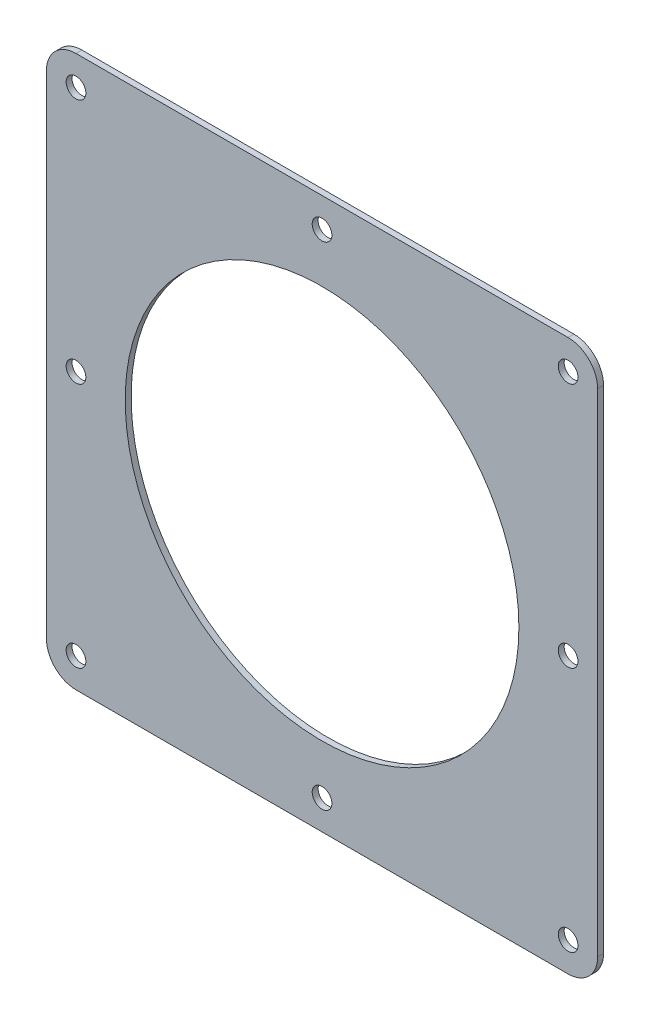
ISO-10303-21;
HEADER;
FILE_DESCRIPTION(('STEP AP214'),'2;1');
FILE_NAME('part.step','',(''),(''),'','','');
FILE_SCHEMA(('AUTOMOTIVE_DESIGN { 1 0 10303 214 1 1 1 1 }'));
ENDSEC;
DATA;
#1=APPLICATION_CONTEXT('core data for automotive mechanical design processes');
#2=APPLICATION_PROTOCOL_DEFINITION('international standard','automotive_design',2000,#1);
#3=PRODUCT_CONTEXT('',#1,'mechanical');
#4=PRODUCT('Part','Part','',(#3));
#5=PRODUCT_RELATED_PRODUCT_CATEGORY('part','',(#4));
#6=PRODUCT_DEFINITION_FORMATION('','',#4);
#7=PRODUCT_DEFINITION_CONTEXT('part definition',#1,'design');
#8=PRODUCT_DEFINITION('design','',#6,#7);
#9=PRODUCT_DEFINITION_SHAPE('','',#8);
#10=(LENGTH_UNIT() NAMED_UNIT(*) SI_UNIT(.MILLI.,.METRE.));
#11=(NAMED_UNIT(*) PLANE_ANGLE_UNIT() SI_UNIT($,.RADIAN.));
#12=(NAMED_UNIT(*) SI_UNIT($,.STERADIAN.) SOLID_ANGLE_UNIT());
#13=UNCERTAINTY_MEASURE_WITH_UNIT(LENGTH_MEASURE(1.E-05),#10,'distance_accuracy_value','');
#14=(GEOMETRIC_REPRESENTATION_CONTEXT(3) GLOBAL_UNCERTAINTY_ASSIGNED_CONTEXT((#13)) GLOBAL_UNIT_ASSIGNED_CONTEXT((#10,
#11,#12)) REPRESENTATION_CONTEXT('',''));
#15=CARTESIAN_POINT('',(0.,0.,0.));
#16=DIRECTION('',(0.,0.,1.));
#17=DIRECTION('',(1.,0.,0.));
#18=AXIS2_PLACEMENT_3D('',#15,#16,#17);
#19=CARTESIAN_POINT('',(-125.,-125.,3.));
#20=DIRECTION('',(0.,0.,1.));
#21=DIRECTION('',(1.,0.,0.));
#22=AXIS2_PLACEMENT_3D('',#19,#20,#21);
#23=PLANE('',#22);
#24=CARTESIAN_POINT('',(0.,0.,3.));
#25=DIRECTION('',(0.,0.,1.));
#26=DIRECTION('',(1.,0.,0.));
#27=AXIS2_PLACEMENT_3D('',#24,#25,#26);
#28=CIRCLE('',#27,100.);
#29=CARTESIAN_POINT('',(100.,0.,3.));
#30=VERTEX_POINT('',#29);
#31=EDGE_CURVE('E227',#30,#30,#28,.T.);
#32=ORIENTED_EDGE('',*,*,#31,.F.);
#33=EDGE_LOOP('',(#32));
#34=FACE_BOUND('',#33,.T.);
#35=CARTESIAN_POINT('',(0.,-125.,3.));
#36=DIRECTION('',(0.,0.,1.));
#37=DIRECTION('',(1.,0.,0.));
#38=AXIS2_PLACEMENT_3D('',#35,#36,#37);
#39=CIRCLE('',#38,5.);
#40=CARTESIAN_POINT('',(5.,-125.,3.));
#41=VERTEX_POINT('',#40);
#42=EDGE_CURVE('E213',#41,#41,#39,.T.);
#43=ORIENTED_EDGE('',*,*,#42,.F.);
#44=EDGE_LOOP('',(#43));
#45=FACE_BOUND('',#44,.T.);
#46=CARTESIAN_POINT('',(125.,0.,3.));
#47=DIRECTION('',(0.,0.,1.));
#48=DIRECTION('',(1.,0.,0.));
#49=AXIS2_PLACEMENT_3D('',#46,#47,#48);
#50=CIRCLE('',#49,5.00000000000001);
#51=CARTESIAN_POINT('',(130.,0.,3.));
#52=VERTEX_POINT('',#51);
#53=EDGE_CURVE('E195',#52,#52,#50,.T.);
#54=ORIENTED_EDGE('',*,*,#53,.F.);
#55=EDGE_LOOP('',(#54));
#56=FACE_BOUND('',#55,.T.);
#57=CARTESIAN_POINT('',(0.,125.,3.));
#58=DIRECTION('',(0.,0.,1.));
#59=DIRECTION('',(1.,0.,0.));
#60=AXIS2_PLACEMENT_3D('',#57,#58,#59);
#61=CIRCLE('',#60,5.);
#62=CARTESIAN_POINT('',(4.99999999999999,125.,3.));
#63=VERTEX_POINT('',#62);
#64=EDGE_CURVE('E183',#63,#63,#61,.T.);
#65=ORIENTED_EDGE('',*,*,#64,.F.);
#66=EDGE_LOOP('',(#65));
#67=FACE_BOUND('',#66,.T.);
#68=CARTESIAN_POINT('',(-125.,-125.,3.));
#69=DIRECTION('',(0.,0.,1.));
#70=DIRECTION('',(1.,0.,0.));
#71=AXIS2_PLACEMENT_3D('',#68,#69,#70);
#72=CIRCLE('',#71,15.);
#73=CARTESIAN_POINT('',(-140.,-125.,3.));
#74=VERTEX_POINT('',#73);
#75=CARTESIAN_POINT('',(-125.,-140.,3.));
#76=VERTEX_POINT('',#75);
#77=EDGE_CURVE('E145',#74,#76,#72,.T.);
#78=ORIENTED_EDGE('',*,*,#77,.T.);
#79=DIRECTION('',(1.,0.,0.));
#80=VECTOR('',#79,1.);
#81=CARTESIAN_POINT('',(-125.,-140.,3.));
#82=LINE('',#81,#80);
#83=CARTESIAN_POINT('',(125.,-140.,3.));
#84=VERTEX_POINT('',#83);
#85=EDGE_CURVE('E93',#76,#84,#82,.T.);
#86=ORIENTED_EDGE('',*,*,#85,.T.);
#87=CARTESIAN_POINT('',(125.,-125.,3.));
#88=DIRECTION('',(0.,0.,1.));
#89=DIRECTION('',(1.,0.,0.));
#90=AXIS2_PLACEMENT_3D('',#87,#88,#89);
#91=CIRCLE('',#90,15.);
#92=CARTESIAN_POINT('',(140.,-125.,3.));
#93=VERTEX_POINT('',#92);
#94=EDGE_CURVE('E161',#84,#93,#91,.T.);
#95=ORIENTED_EDGE('',*,*,#94,.T.);
#96=DIRECTION('',(0.,1.,0.));
#97=VECTOR('',#96,1.);
#98=CARTESIAN_POINT('',(140.,125.,3.));
#99=LINE('',#98,#97);
#100=CARTESIAN_POINT('',(140.,125.,3.));
#101=VERTEX_POINT('',#100);
#102=EDGE_CURVE('E174',#93,#101,#99,.T.);
#103=ORIENTED_EDGE('',*,*,#102,.T.);
#104=CARTESIAN_POINT('',(125.,125.,3.));
#105=DIRECTION('',(0.,0.,1.));
#106=DIRECTION('',(-1.,0.,0.));
#107=AXIS2_PLACEMENT_3D('',#104,#105,#106);
#108=CIRCLE('',#107,15.);
#109=CARTESIAN_POINT('',(125.,140.,3.));
#110=VERTEX_POINT('',#109);
#111=EDGE_CURVE('E112',#101,#110,#108,.T.);
#112=ORIENTED_EDGE('',*,*,#111,.T.);
#113=DIRECTION('',(-1.,0.,0.));
#114=VECTOR('',#113,1.);
#115=CARTESIAN_POINT('',(-125.,140.,3.));
#116=LINE('',#115,#114);
#117=CARTESIAN_POINT('',(-125.,140.,3.));
#118=VERTEX_POINT('',#117);
#119=EDGE_CURVE('E106',#110,#118,#116,.T.);
#120=ORIENTED_EDGE('',*,*,#119,.T.);
#121=CARTESIAN_POINT('',(-125.,125.,3.));
#122=DIRECTION('',(0.,0.,1.));
#123=DIRECTION('',(1.,0.,0.));
#124=AXIS2_PLACEMENT_3D('',#121,#122,#123);
#125=CIRCLE('',#124,15.);
#126=CARTESIAN_POINT('',(-140.,125.,3.));
#127=VERTEX_POINT('',#126);
#128=EDGE_CURVE('E110',#118,#127,#125,.T.);
#129=ORIENTED_EDGE('',*,*,#128,.T.);
#130=DIRECTION('',(0.,-1.,0.));
#131=VECTOR('',#130,1.);
#132=CARTESIAN_POINT('',(-140.,125.,3.));
#133=LINE('',#132,#131);
#134=EDGE_CURVE('E50',#127,#74,#133,.T.);
#135=ORIENTED_EDGE('',*,*,#134,.T.);
#136=EDGE_LOOP('',(#78,#86,#95,#103,#112,#120,#129,#135));
#137=FACE_BOUND('',#136,.T.);
#138=CARTESIAN_POINT('',(-125.,125.,3.));
#139=DIRECTION('',(0.,0.,1.));
#140=DIRECTION('',(1.,0.,0.));
#141=AXIS2_PLACEMENT_3D('',#138,#139,#140);
#142=CIRCLE('',#141,5.00000000000001);
#143=CARTESIAN_POINT('',(-120.,125.,3.));
#144=VERTEX_POINT('',#143);
#145=EDGE_CURVE('E134',#144,#144,#142,.T.);
#146=ORIENTED_EDGE('',*,*,#145,.F.);
#147=EDGE_LOOP('',(#146));
#148=FACE_BOUND('',#147,.T.);
#149=CARTESIAN_POINT('',(125.,125.,3.));
#150=DIRECTION('',(0.,0.,1.));
#151=DIRECTION('',(1.,0.,0.));
#152=AXIS2_PLACEMENT_3D('',#149,#150,#151);
#153=CIRCLE('',#152,4.99999999999999);
#154=CARTESIAN_POINT('',(130.,125.,3.));
#155=VERTEX_POINT('',#154);
#156=EDGE_CURVE('E189',#155,#155,#153,.T.);
#157=ORIENTED_EDGE('',*,*,#156,.F.);
#158=EDGE_LOOP('',(#157));
#159=FACE_BOUND('',#158,.T.);
#160=CARTESIAN_POINT('',(-125.,0.,3.));
#161=DIRECTION('',(0.,0.,1.));
#162=DIRECTION('',(1.,0.,0.));
#163=AXIS2_PLACEMENT_3D('',#160,#161,#162);
#164=CIRCLE('',#163,5.);
#165=CARTESIAN_POINT('',(-120.,0.,3.));
#166=VERTEX_POINT('',#165);
#167=EDGE_CURVE('E201',#166,#166,#164,.T.);
#168=ORIENTED_EDGE('',*,*,#167,.F.);
#169=EDGE_LOOP('',(#168));
#170=FACE_BOUND('',#169,.T.);
#171=CARTESIAN_POINT('',(-125.,-125.,3.));
#172=DIRECTION('',(0.,0.,1.));
#173=DIRECTION('',(1.,0.,0.));
#174=AXIS2_PLACEMENT_3D('',#171,#172,#173);
#175=CIRCLE('',#174,5.00000000000001);
#176=CARTESIAN_POINT('',(-120.,-125.,3.));
#177=VERTEX_POINT('',#176);
#178=EDGE_CURVE('E207',#177,#177,#175,.T.);
#179=ORIENTED_EDGE('',*,*,#178,.F.);
#180=EDGE_LOOP('',(#179));
#181=FACE_BOUND('',#180,.T.);
#182=CARTESIAN_POINT('',(125.,-125.,3.));
#183=DIRECTION('',(0.,0.,1.));
#184=DIRECTION('',(1.,0.,0.));
#185=AXIS2_PLACEMENT_3D('',#182,#183,#184);
#186=CIRCLE('',#185,5.00000000000002);
#187=CARTESIAN_POINT('',(130.,-125.,3.));
#188=VERTEX_POINT('',#187);
#189=EDGE_CURVE('E219',#188,#188,#186,.T.);
#190=ORIENTED_EDGE('',*,*,#189,.F.);
#191=EDGE_LOOP('',(#190));
#192=FACE_BOUND('',#191,.T.);
#193=ADVANCED_FACE('F32',(#34,#45,#56,#67,#137,#148,#159,#170,#181,#192),#23,.T.);
#194=CARTESIAN_POINT('',(-125.,-125.,0.));
#195=DIRECTION('',(0.,0.,1.));
#196=DIRECTION('',(1.,0.,0.));
#197=AXIS2_PLACEMENT_3D('',#194,#195,#196);
#198=PLANE('',#197);
#199=CARTESIAN_POINT('',(0.,0.,0.));
#200=DIRECTION('',(0.,0.,1.));
#201=DIRECTION('',(1.,0.,0.));
#202=AXIS2_PLACEMENT_3D('',#199,#200,#201);
#203=CIRCLE('',#202,100.);
#204=CARTESIAN_POINT('',(100.,0.,0.));
#205=VERTEX_POINT('',#204);
#206=EDGE_CURVE('E36',#205,#205,#203,.T.);
#207=ORIENTED_EDGE('',*,*,#206,.T.);
#208=EDGE_LOOP('',(#207));
#209=FACE_BOUND('',#208,.T.);
#210=CARTESIAN_POINT('',(-125.,-125.,0.));
#211=DIRECTION('',(0.,0.,1.));
#212=DIRECTION('',(1.,0.,0.));
#213=AXIS2_PLACEMENT_3D('',#210,#211,#212);
#214=CIRCLE('',#213,15.);
#215=CARTESIAN_POINT('',(-140.,-125.,0.));
#216=VERTEX_POINT('',#215);
#217=CARTESIAN_POINT('',(-125.,-140.,0.));
#218=VERTEX_POINT('',#217);
#219=EDGE_CURVE('E130',#216,#218,#214,.T.);
#220=ORIENTED_EDGE('',*,*,#219,.F.);
#221=DIRECTION('',(0.,-1.,0.));
#222=VECTOR('',#221,1.);
#223=CARTESIAN_POINT('',(-140.,125.,0.));
#224=LINE('',#223,#222);
#225=CARTESIAN_POINT('',(-140.,125.,0.));
#226=VERTEX_POINT('',#225);
#227=EDGE_CURVE('E85',#226,#216,#224,.T.);
#228=ORIENTED_EDGE('',*,*,#227,.F.);
#229=CARTESIAN_POINT('',(-125.,125.,0.));
#230=DIRECTION('',(0.,0.,1.));
#231=DIRECTION('',(1.,0.,0.));
#232=AXIS2_PLACEMENT_3D('',#229,#230,#231);
#233=CIRCLE('',#232,15.);
#234=CARTESIAN_POINT('',(-125.,140.,0.));
#235=VERTEX_POINT('',#234);
#236=EDGE_CURVE('E79',#235,#226,#233,.T.);
#237=ORIENTED_EDGE('',*,*,#236,.F.);
#238=DIRECTION('',(-1.,0.,0.));
#239=VECTOR('',#238,1.);
#240=CARTESIAN_POINT('',(-125.,140.,0.));
#241=LINE('',#240,#239);
#242=CARTESIAN_POINT('',(125.,140.,0.));
#243=VERTEX_POINT('',#242);
#244=EDGE_CURVE('E120',#243,#235,#241,.T.);
#245=ORIENTED_EDGE('',*,*,#244,.F.);
#246=CARTESIAN_POINT('',(125.,125.,0.));
#247=DIRECTION('',(0.,0.,1.));
#248=DIRECTION('',(-1.,0.,0.));
#249=AXIS2_PLACEMENT_3D('',#246,#247,#248);
#250=CIRCLE('',#249,15.);
#251=CARTESIAN_POINT('',(140.,125.,0.));
#252=VERTEX_POINT('',#251);
#253=EDGE_CURVE('E140',#252,#243,#250,.T.);
#254=ORIENTED_EDGE('',*,*,#253,.F.);
#255=DIRECTION('',(0.,1.,0.));
#256=VECTOR('',#255,1.);
#257=CARTESIAN_POINT('',(140.,125.,0.));
#258=LINE('',#257,#256);
#259=CARTESIAN_POINT('',(140.,-125.,0.));
#260=VERTEX_POINT('',#259);
#261=EDGE_CURVE('E138',#260,#252,#258,.T.);
#262=ORIENTED_EDGE('',*,*,#261,.F.);
#263=CARTESIAN_POINT('',(125.,-125.,0.));
#264=DIRECTION('',(0.,0.,1.));
#265=DIRECTION('',(1.,0.,0.));
#266=AXIS2_PLACEMENT_3D('',#263,#264,#265);
#267=CIRCLE('',#266,15.);
#268=CARTESIAN_POINT('',(125.,-140.,0.));
#269=VERTEX_POINT('',#268);
#270=EDGE_CURVE('E136',#269,#260,#267,.T.);
#271=ORIENTED_EDGE('',*,*,#270,.F.);
#272=DIRECTION('',(1.,0.,0.));
#273=VECTOR('',#272,1.);
#274=CARTESIAN_POINT('',(-125.,-140.,0.));
#275=LINE('',#274,#273);
#276=EDGE_CURVE('E133',#218,#269,#275,.T.);
#277=ORIENTED_EDGE('',*,*,#276,.F.);
#278=EDGE_LOOP('',(#220,#228,#237,#245,#254,#262,#271,#277));
#279=FACE_BOUND('',#278,.T.);
#280=CARTESIAN_POINT('',(-125.,125.,0.));
#281=DIRECTION('',(0.,0.,1.));
#282=DIRECTION('',(1.,0.,0.));
#283=AXIS2_PLACEMENT_3D('',#280,#281,#282);
#284=CIRCLE('',#283,5.00000000000001);
#285=CARTESIAN_POINT('',(-120.,125.,0.));
#286=VERTEX_POINT('',#285);
#287=EDGE_CURVE('E180',#286,#286,#284,.T.);
#288=ORIENTED_EDGE('',*,*,#287,.T.);
#289=EDGE_LOOP('',(#288));
#290=FACE_BOUND('',#289,.T.);
#291=CARTESIAN_POINT('',(0.,125.,0.));
#292=DIRECTION('',(0.,0.,1.));
#293=DIRECTION('',(1.,0.,0.));
#294=AXIS2_PLACEMENT_3D('',#291,#292,#293);
#295=CIRCLE('',#294,5.);
#296=CARTESIAN_POINT('',(4.99999999999999,125.,0.));
#297=VERTEX_POINT('',#296);
#298=EDGE_CURVE('E186',#297,#297,#295,.T.);
#299=ORIENTED_EDGE('',*,*,#298,.T.);
#300=EDGE_LOOP('',(#299));
#301=FACE_BOUND('',#300,.T.);
#302=CARTESIAN_POINT('',(125.,125.,0.));
#303=DIRECTION('',(0.,0.,1.));
#304=DIRECTION('',(1.,0.,0.));
#305=AXIS2_PLACEMENT_3D('',#302,#303,#304);
#306=CIRCLE('',#305,4.99999999999999);
#307=CARTESIAN_POINT('',(130.,125.,0.));
#308=VERTEX_POINT('',#307);
#309=EDGE_CURVE('E192',#308,#308,#306,.T.);
#310=ORIENTED_EDGE('',*,*,#309,.T.);
#311=EDGE_LOOP('',(#310));
#312=FACE_BOUND('',#311,.T.);
#313=CARTESIAN_POINT('',(125.,0.,0.));
#314=DIRECTION('',(0.,0.,1.));
#315=DIRECTION('',(1.,0.,0.));
#316=AXIS2_PLACEMENT_3D('',#313,#314,#315);
#317=CIRCLE('',#316,5.00000000000001);
#318=CARTESIAN_POINT('',(130.,0.,0.));
#319=VERTEX_POINT('',#318);
#320=EDGE_CURVE('E198',#319,#319,#317,.T.);
#321=ORIENTED_EDGE('',*,*,#320,.T.);
#322=EDGE_LOOP('',(#321));
#323=FACE_BOUND('',#322,.T.);
#324=CARTESIAN_POINT('',(-125.,0.,0.));
#325=DIRECTION('',(0.,0.,1.));
#326=DIRECTION('',(1.,0.,0.));
#327=AXIS2_PLACEMENT_3D('',#324,#325,#326);
#328=CIRCLE('',#327,5.);
#329=CARTESIAN_POINT('',(-120.,0.,0.));
#330=VERTEX_POINT('',#329);
#331=EDGE_CURVE('E204',#330,#330,#328,.T.);
#332=ORIENTED_EDGE('',*,*,#331,.T.);
#333=EDGE_LOOP('',(#332));
#334=FACE_BOUND('',#333,.T.);
#335=CARTESIAN_POINT('',(-125.,-125.,0.));
#336=DIRECTION('',(0.,0.,1.));
#337=DIRECTION('',(1.,0.,0.));
#338=AXIS2_PLACEMENT_3D('',#335,#336,#337);
#339=CIRCLE('',#338,5.00000000000001);
#340=CARTESIAN_POINT('',(-120.,-125.,0.));
#341=VERTEX_POINT('',#340);
#342=EDGE_CURVE('E210',#341,#341,#339,.T.);
#343=ORIENTED_EDGE('',*,*,#342,.T.);
#344=EDGE_LOOP('',(#343));
#345=FACE_BOUND('',#344,.T.);
#346=CARTESIAN_POINT('',(0.,-125.,0.));
#347=DIRECTION('',(0.,0.,1.));
#348=DIRECTION('',(1.,0.,0.));
#349=AXIS2_PLACEMENT_3D('',#346,#347,#348);
#350=CIRCLE('',#349,5.);
#351=CARTESIAN_POINT('',(5.,-125.,0.));
#352=VERTEX_POINT('',#351);
#353=EDGE_CURVE('E216',#352,#352,#350,.T.);
#354=ORIENTED_EDGE('',*,*,#353,.T.);
#355=EDGE_LOOP('',(#354));
#356=FACE_BOUND('',#355,.T.);
#357=CARTESIAN_POINT('',(125.,-125.,0.));
#358=DIRECTION('',(0.,0.,1.));
#359=DIRECTION('',(1.,0.,0.));
#360=AXIS2_PLACEMENT_3D('',#357,#358,#359);
#361=CIRCLE('',#360,5.00000000000002);
#362=CARTESIAN_POINT('',(130.,-125.,0.));
#363=VERTEX_POINT('',#362);
#364=EDGE_CURVE('E222',#363,#363,#361,.T.);
#365=ORIENTED_EDGE('',*,*,#364,.T.);
#366=EDGE_LOOP('',(#365));
#367=FACE_BOUND('',#366,.T.);
#368=ADVANCED_FACE('F165',(#209,#279,#290,#301,#312,#323,#334,#345,#356,#367),#198,.F.);
#369=CARTESIAN_POINT('',(-125.,-125.,3.));
#370=DIRECTION('',(0.,0.,-1.));
#371=DIRECTION('',(-1.,0.,0.));
#372=AXIS2_PLACEMENT_3D('',#369,#370,#371);
#373=CYLINDRICAL_SURFACE('',#372,15.);
#374=ORIENTED_EDGE('',*,*,#219,.T.);
#375=DIRECTION('',(0.,0.,-1.));
#376=VECTOR('',#375,1.);
#377=CARTESIAN_POINT('',(-125.,-140.,3.));
#378=LINE('',#377,#376);
#379=EDGE_CURVE('E11',#76,#218,#378,.T.);
#380=ORIENTED_EDGE('',*,*,#379,.F.);
#381=ORIENTED_EDGE('',*,*,#77,.F.);
#382=DIRECTION('',(0.,0.,-1.));
#383=VECTOR('',#382,1.);
#384=CARTESIAN_POINT('',(-140.,-125.,3.));
#385=LINE('',#384,#383);
#386=EDGE_CURVE('E126',#74,#216,#385,.T.);
#387=ORIENTED_EDGE('',*,*,#386,.T.);
#388=EDGE_LOOP('',(#374,#380,#381,#387));
#389=FACE_BOUND('',#388,.T.);
#390=ADVANCED_FACE('F34',(#389),#373,.T.);
#391=CARTESIAN_POINT('',(-125.,-140.,3.));
#392=DIRECTION('',(0.,1.,0.));
#393=DIRECTION('',(0.,0.,1.));
#394=AXIS2_PLACEMENT_3D('',#391,#392,#393);
#395=PLANE('',#394);
#396=ORIENTED_EDGE('',*,*,#276,.T.);
#397=DIRECTION('',(0.,0.,-1.));
#398=VECTOR('',#397,1.);
#399=CARTESIAN_POINT('',(125.,-140.,3.));
#400=LINE('',#399,#398);
#401=EDGE_CURVE('E42',#84,#269,#400,.T.);
#402=ORIENTED_EDGE('',*,*,#401,.F.);
#403=ORIENTED_EDGE('',*,*,#85,.F.);
#404=ORIENTED_EDGE('',*,*,#379,.T.);
#405=EDGE_LOOP('',(#396,#402,#403,#404));
#406=FACE_BOUND('',#405,.T.);
#407=ADVANCED_FACE('F269',(#406),#395,.F.);
#408=CARTESIAN_POINT('',(125.,-125.,3.));
#409=DIRECTION('',(0.,0.,-1.));
#410=DIRECTION('',(-1.,0.,0.));
#411=AXIS2_PLACEMENT_3D('',#408,#409,#410);
#412=CYLINDRICAL_SURFACE('',#411,15.);
#413=ORIENTED_EDGE('',*,*,#270,.T.);
#414=DIRECTION('',(0.,0.,-1.));
#415=VECTOR('',#414,1.);
#416=CARTESIAN_POINT('',(140.,-125.,3.));
#417=LINE('',#416,#415);
#418=EDGE_CURVE('E152',#93,#260,#417,.T.);
#419=ORIENTED_EDGE('',*,*,#418,.F.);
#420=ORIENTED_EDGE('',*,*,#94,.F.);
#421=ORIENTED_EDGE('',*,*,#401,.T.);
#422=EDGE_LOOP('',(#413,#419,#420,#421));
#423=FACE_BOUND('',#422,.T.);
#424=ADVANCED_FACE('F159',(#423),#412,.T.);
#425=CARTESIAN_POINT('',(140.,125.,3.));
#426=DIRECTION('',(-1.,0.,0.));
#427=DIRECTION('',(0.,0.,1.));
#428=AXIS2_PLACEMENT_3D('',#425,#426,#427);
#429=PLANE('',#428);
#430=ORIENTED_EDGE('',*,*,#261,.T.);
#431=DIRECTION('',(0.,0.,-1.));
#432=VECTOR('',#431,1.);
#433=CARTESIAN_POINT('',(140.,125.,3.));
#434=LINE('',#433,#432);
#435=EDGE_CURVE('E149',#101,#252,#434,.T.);
#436=ORIENTED_EDGE('',*,*,#435,.F.);
#437=ORIENTED_EDGE('',*,*,#102,.F.);
#438=ORIENTED_EDGE('',*,*,#418,.T.);
#439=EDGE_LOOP('',(#430,#436,#437,#438));
#440=FACE_BOUND('',#439,.T.);
#441=ADVANCED_FACE('F170',(#440),#429,.F.);
#442=CARTESIAN_POINT('',(125.,125.,3.));
#443=DIRECTION('',(0.,0.,-1.));
#444=DIRECTION('',(-1.,0.,0.));
#445=AXIS2_PLACEMENT_3D('',#442,#443,#444);
#446=CYLINDRICAL_SURFACE('',#445,15.);
#447=ORIENTED_EDGE('',*,*,#253,.T.);
#448=DIRECTION('',(0.,0.,-1.));
#449=VECTOR('',#448,1.);
#450=CARTESIAN_POINT('',(125.,140.,3.));
#451=LINE('',#450,#449);
#452=EDGE_CURVE('E121',#110,#243,#451,.T.);
#453=ORIENTED_EDGE('',*,*,#452,.F.);
#454=ORIENTED_EDGE('',*,*,#111,.F.);
#455=ORIENTED_EDGE('',*,*,#435,.T.);
#456=EDGE_LOOP('',(#447,#453,#454,#455));
#457=FACE_BOUND('',#456,.T.);
#458=ADVANCED_FACE('F173',(#457),#446,.T.);
#459=CARTESIAN_POINT('',(-125.,140.,3.));
#460=DIRECTION('',(0.,-1.,0.));
#461=DIRECTION('',(0.,0.,-1.));
#462=AXIS2_PLACEMENT_3D('',#459,#460,#461);
#463=PLANE('',#462);
#464=ORIENTED_EDGE('',*,*,#244,.T.);
#465=DIRECTION('',(0.,0.,-1.));
#466=VECTOR('',#465,1.);
#467=CARTESIAN_POINT('',(-125.,140.,3.));
#468=LINE('',#467,#466);
#469=EDGE_CURVE('E117',#118,#235,#468,.T.);
#470=ORIENTED_EDGE('',*,*,#469,.F.);
#471=ORIENTED_EDGE('',*,*,#119,.F.);
#472=ORIENTED_EDGE('',*,*,#452,.T.);
#473=EDGE_LOOP('',(#464,#470,#471,#472));
#474=FACE_BOUND('',#473,.T.);
#475=ADVANCED_FACE('F118',(#474),#463,.F.);
#476=CARTESIAN_POINT('',(-125.,125.,3.));
#477=DIRECTION('',(0.,0.,-1.));
#478=DIRECTION('',(-1.,0.,0.));
#479=AXIS2_PLACEMENT_3D('',#476,#477,#478);
#480=CYLINDRICAL_SURFACE('',#479,15.);
#481=ORIENTED_EDGE('',*,*,#236,.T.);
#482=DIRECTION('',(0.,0.,-1.));
#483=VECTOR('',#482,1.);
#484=CARTESIAN_POINT('',(-140.,125.,3.));
#485=LINE('',#484,#483);
#486=EDGE_CURVE('E122',#127,#226,#485,.T.);
#487=ORIENTED_EDGE('',*,*,#486,.F.);
#488=ORIENTED_EDGE('',*,*,#128,.F.);
#489=ORIENTED_EDGE('',*,*,#469,.T.);
#490=EDGE_LOOP('',(#481,#487,#488,#489));
#491=FACE_BOUND('',#490,.T.);
#492=ADVANCED_FACE('F124',(#491),#480,.T.);
#493=CARTESIAN_POINT('',(-140.,125.,3.));
#494=DIRECTION('',(1.,0.,0.));
#495=DIRECTION('',(0.,0.,-1.));
#496=AXIS2_PLACEMENT_3D('',#493,#494,#495);
#497=PLANE('',#496);
#498=ORIENTED_EDGE('',*,*,#227,.T.);
#499=ORIENTED_EDGE('',*,*,#386,.F.);
#500=ORIENTED_EDGE('',*,*,#134,.F.);
#501=ORIENTED_EDGE('',*,*,#486,.T.);
#502=EDGE_LOOP('',(#498,#499,#500,#501));
#503=FACE_BOUND('',#502,.T.);
#504=ADVANCED_FACE('F257',(#503),#497,.F.);
#505=CARTESIAN_POINT('',(-125.,125.,3.));
#506=DIRECTION('',(0.,0.,-1.));
#507=DIRECTION('',(-1.,0.,0.));
#508=AXIS2_PLACEMENT_3D('',#505,#506,#507);
#509=CYLINDRICAL_SURFACE('',#508,5.00000000000001);
#510=ORIENTED_EDGE('',*,*,#145,.T.);
#511=EDGE_LOOP('',(#510));
#512=FACE_BOUND('',#511,.T.);
#513=ORIENTED_EDGE('',*,*,#287,.F.);
#514=EDGE_LOOP('',(#513));
#515=FACE_BOUND('',#514,.T.);
#516=ADVANCED_FACE('F254',(#512,#515),#509,.F.);
#517=CARTESIAN_POINT('',(0.,125.,3.));
#518=DIRECTION('',(0.,0.,-1.));
#519=DIRECTION('',(-1.,0.,0.));
#520=AXIS2_PLACEMENT_3D('',#517,#518,#519);
#521=CYLINDRICAL_SURFACE('',#520,5.);
#522=ORIENTED_EDGE('',*,*,#64,.T.);
#523=EDGE_LOOP('',(#522));
#524=FACE_BOUND('',#523,.T.);
#525=ORIENTED_EDGE('',*,*,#298,.F.);
#526=EDGE_LOOP('',(#525));
#527=FACE_BOUND('',#526,.T.);
#528=ADVANCED_FACE('F340',(#524,#527),#521,.F.);
#529=CARTESIAN_POINT('',(125.,125.,3.));
#530=DIRECTION('',(0.,0.,-1.));
#531=DIRECTION('',(-1.,0.,0.));
#532=AXIS2_PLACEMENT_3D('',#529,#530,#531);
#533=CYLINDRICAL_SURFACE('',#532,4.99999999999999);
#534=ORIENTED_EDGE('',*,*,#156,.T.);
#535=EDGE_LOOP('',(#534));
#536=FACE_BOUND('',#535,.T.);
#537=ORIENTED_EDGE('',*,*,#309,.F.);
#538=EDGE_LOOP('',(#537));
#539=FACE_BOUND('',#538,.T.);
#540=ADVANCED_FACE('F331',(#536,#539),#533,.F.);
#541=CARTESIAN_POINT('',(125.,0.,3.));
#542=DIRECTION('',(0.,0.,-1.));
#543=DIRECTION('',(-1.,0.,0.));
#544=AXIS2_PLACEMENT_3D('',#541,#542,#543);
#545=CYLINDRICAL_SURFACE('',#544,5.00000000000001);
#546=ORIENTED_EDGE('',*,*,#53,.T.);
#547=EDGE_LOOP('',(#546));
#548=FACE_BOUND('',#547,.T.);
#549=ORIENTED_EDGE('',*,*,#320,.F.);
#550=EDGE_LOOP('',(#549));
#551=FACE_BOUND('',#550,.T.);
#552=ADVANCED_FACE('F322',(#548,#551),#545,.F.);
#553=CARTESIAN_POINT('',(-125.,0.,3.));
#554=DIRECTION('',(0.,0.,-1.));
#555=DIRECTION('',(-1.,0.,0.));
#556=AXIS2_PLACEMENT_3D('',#553,#554,#555);
#557=CYLINDRICAL_SURFACE('',#556,5.);
#558=ORIENTED_EDGE('',*,*,#167,.T.);
#559=EDGE_LOOP('',(#558));
#560=FACE_BOUND('',#559,.T.);
#561=ORIENTED_EDGE('',*,*,#331,.F.);
#562=EDGE_LOOP('',(#561));
#563=FACE_BOUND('',#562,.T.);
#564=ADVANCED_FACE('F313',(#560,#563),#557,.F.);
#565=CARTESIAN_POINT('',(-125.,-125.,3.));
#566=DIRECTION('',(0.,0.,-1.));
#567=DIRECTION('',(-1.,0.,0.));
#568=AXIS2_PLACEMENT_3D('',#565,#566,#567);
#569=CYLINDRICAL_SURFACE('',#568,5.00000000000001);
#570=ORIENTED_EDGE('',*,*,#178,.T.);
#571=EDGE_LOOP('',(#570));
#572=FACE_BOUND('',#571,.T.);
#573=ORIENTED_EDGE('',*,*,#342,.F.);
#574=EDGE_LOOP('',(#573));
#575=FACE_BOUND('',#574,.T.);
#576=ADVANCED_FACE('F304',(#572,#575),#569,.F.);
#577=CARTESIAN_POINT('',(0.,-125.,3.));
#578=DIRECTION('',(0.,0.,-1.));
#579=DIRECTION('',(-1.,0.,0.));
#580=AXIS2_PLACEMENT_3D('',#577,#578,#579);
#581=CYLINDRICAL_SURFACE('',#580,5.);
#582=ORIENTED_EDGE('',*,*,#42,.T.);
#583=EDGE_LOOP('',(#582));
#584=FACE_BOUND('',#583,.T.);
#585=ORIENTED_EDGE('',*,*,#353,.F.);
#586=EDGE_LOOP('',(#585));
#587=FACE_BOUND('',#586,.T.);
#588=ADVANCED_FACE('F242',(#584,#587),#581,.F.);
#589=CARTESIAN_POINT('',(125.,-125.,3.));
#590=DIRECTION('',(0.,0.,-1.));
#591=DIRECTION('',(-1.,0.,0.));
#592=AXIS2_PLACEMENT_3D('',#589,#590,#591);
#593=CYLINDRICAL_SURFACE('',#592,5.00000000000002);
#594=ORIENTED_EDGE('',*,*,#189,.T.);
#595=EDGE_LOOP('',(#594));
#596=FACE_BOUND('',#595,.T.);
#597=ORIENTED_EDGE('',*,*,#364,.F.);
#598=EDGE_LOOP('',(#597));
#599=FACE_BOUND('',#598,.T.);
#600=ADVANCED_FACE('F237',(#596,#599),#593,.F.);
#601=CARTESIAN_POINT('',(0.,0.,-7.));
#602=DIRECTION('',(0.,0.,1.));
#603=DIRECTION('',(1.,0.,0.));
#604=AXIS2_PLACEMENT_3D('',#601,#602,#603);
#605=CYLINDRICAL_SURFACE('',#604,100.);
#606=ORIENTED_EDGE('',*,*,#31,.T.);
#607=EDGE_LOOP('',(#606));
#608=FACE_BOUND('',#607,.T.);
#609=ORIENTED_EDGE('',*,*,#206,.F.);
#610=EDGE_LOOP('',(#609));
#611=FACE_BOUND('',#610,.T.);
#612=ADVANCED_FACE('F235',(#608,#611),#605,.F.);
#613=CLOSED_SHELL('',(#193,#368,#390,#407,#424,#441,#458,#475,#492,#504,#516,#528,#540,#552,
#564,#576,#588,#600,#612));
#614=MANIFOLD_SOLID_BREP('B2',#613);
#615=ADVANCED_BREP_SHAPE_REPRESENTATION('',(#18,#614),#14);
#616=SHAPE_DEFINITION_REPRESENTATION(#9,#615);
ENDSEC;
END-ISO-10303-21;
